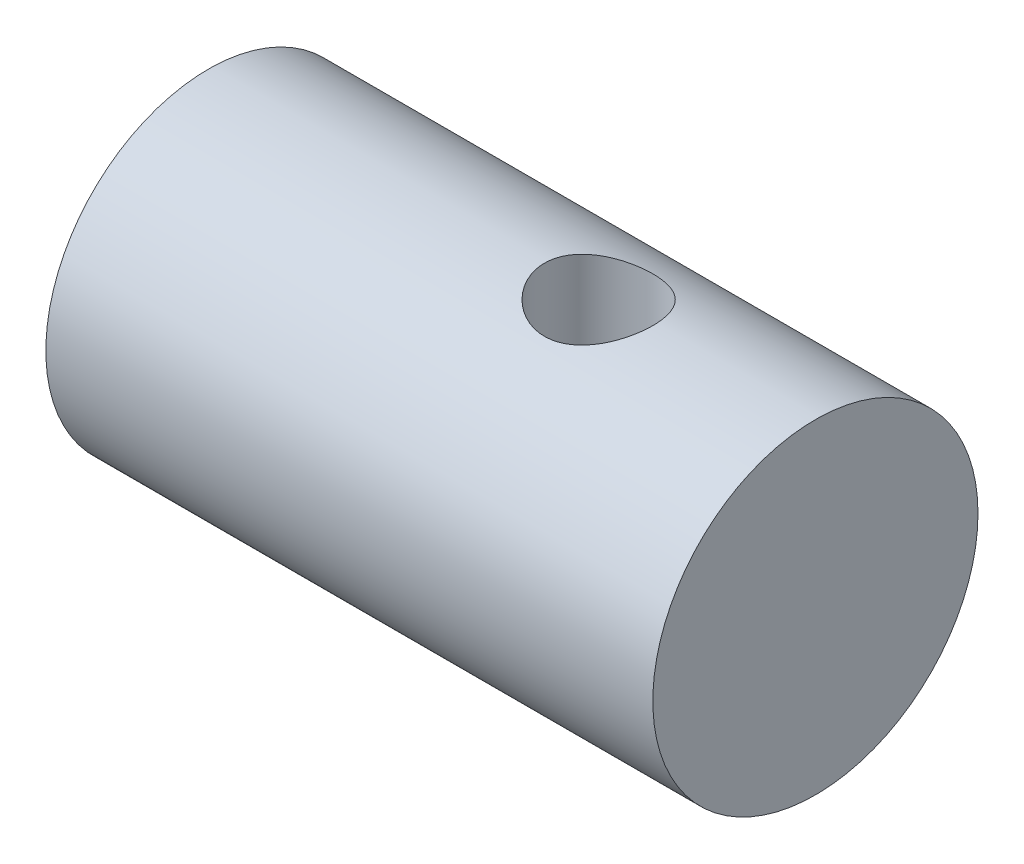
ISO-10303-21;
HEADER;
FILE_DESCRIPTION(('STEP AP214'),'2;1');
FILE_NAME('part.step','',(''),(''),'','','');
FILE_SCHEMA(('AUTOMOTIVE_DESIGN { 1 0 10303 214 1 1 1 1 }'));
ENDSEC;
DATA;
#1=APPLICATION_CONTEXT('core data for automotive mechanical design processes');
#2=APPLICATION_PROTOCOL_DEFINITION('international standard','automotive_design',2000,#1);
#3=PRODUCT_CONTEXT('',#1,'mechanical');
#4=PRODUCT('Part','Part','',(#3));
#5=PRODUCT_RELATED_PRODUCT_CATEGORY('part','',(#4));
#6=PRODUCT_DEFINITION_FORMATION('','',#4);
#7=PRODUCT_DEFINITION_CONTEXT('part definition',#1,'design');
#8=PRODUCT_DEFINITION('design','',#6,#7);
#9=PRODUCT_DEFINITION_SHAPE('','',#8);
#10=(LENGTH_UNIT() NAMED_UNIT(*) SI_UNIT(.MILLI.,.METRE.));
#11=(NAMED_UNIT(*) PLANE_ANGLE_UNIT() SI_UNIT($,.RADIAN.));
#12=(NAMED_UNIT(*) SI_UNIT($,.STERADIAN.) SOLID_ANGLE_UNIT());
#13=UNCERTAINTY_MEASURE_WITH_UNIT(LENGTH_MEASURE(1.E-05),#10,'distance_accuracy_value','');
#14=(GEOMETRIC_REPRESENTATION_CONTEXT(3) GLOBAL_UNCERTAINTY_ASSIGNED_CONTEXT((#13)) GLOBAL_UNIT_ASSIGNED_CONTEXT((#10,
#11,#12)) REPRESENTATION_CONTEXT('',''));
#15=CARTESIAN_POINT('',(0.,0.,0.));
#16=DIRECTION('',(0.,0.,1.));
#17=DIRECTION('',(1.,0.,0.));
#18=AXIS2_PLACEMENT_3D('',#15,#16,#17);
#19=CARTESIAN_POINT('',(2.,-29.,-19.5));
#20=DIRECTION('',(-1.,0.,0.));
#21=DIRECTION('',(0.,0.,1.));
#22=AXIS2_PLACEMENT_3D('',#19,#20,#21);
#23=CYLINDRICAL_SURFACE('',#22,3.);
#24=CARTESIAN_POINT('',(2.,-29.,-19.5));
#25=DIRECTION('',(1.,0.,0.));
#26=DIRECTION('',(0.,0.,-1.));
#27=AXIS2_PLACEMENT_3D('',#24,#25,#26);
#28=CIRCLE('',#27,3.);
#29=CARTESIAN_POINT('',(2.,-29.,-22.5));
#30=VERTEX_POINT('',#29);
#31=EDGE_CURVE('E10',#30,#30,#28,.T.);
#32=ORIENTED_EDGE('',*,*,#31,.F.);
#33=EDGE_LOOP('',(#32));
#34=FACE_BOUND('',#33,.T.);
#35=CARTESIAN_POINT('',(-9.2,-29.,-19.5));
#36=DIRECTION('',(1.,0.,0.));
#37=DIRECTION('',(0.,0.,-1.));
#38=AXIS2_PLACEMENT_3D('',#35,#36,#37);
#39=CIRCLE('',#38,3.);
#40=CARTESIAN_POINT('',(-9.2,-29.,-22.5));
#41=VERTEX_POINT('',#40);
#42=EDGE_CURVE('E51',#41,#41,#39,.T.);
#43=ORIENTED_EDGE('',*,*,#42,.T.);
#44=EDGE_LOOP('',(#43));
#45=FACE_BOUND('',#44,.T.);
#46=CARTESIAN_POINT('',(-2.,-31.8284271247462,-20.5));
#47=CARTESIAN_POINT('',(-1.94553182518932,-31.8284269453273,-20.5000002579478));
#48=CARTESIAN_POINT('',(-1.89106520022847,-31.8300176937281,-20.4955347836981));
#49=CARTESIAN_POINT('',(-1.78374557904938,-31.8361757417458,-20.4778511317026));
#50=CARTESIAN_POINT('',(-1.73089285013606,-31.8407435316722,-20.4646315121707));
#51=CARTESIAN_POINT('',(-1.62837310698719,-31.8522820366389,-20.4299554856803));
#52=CARTESIAN_POINT('',(-1.57870007055312,-31.8592480396464,-20.408515221402));
#53=CARTESIAN_POINT('',(-1.48363995145621,-31.8747912201701,-20.3580616284426));
#54=CARTESIAN_POINT('',(-1.4382538174475,-31.8833687530543,-20.3290466288605));
#55=CARTESIAN_POINT('',(-1.35128003766051,-31.9015448940559,-20.2630511464425));
#56=CARTESIAN_POINT('',(-1.30988457132796,-31.9111689484414,-20.2258243413778));
#57=CARTESIAN_POINT('',(-1.23379319877568,-31.9301386480151,-20.1449876672145));
#58=CARTESIAN_POINT('',(-1.19909836841772,-31.939484248291,-20.1013767750524));
#59=CARTESIAN_POINT('',(-1.13652110267032,-31.9571386692166,-20.007604507965));
#60=CARTESIAN_POINT('',(-1.10884002938202,-31.9654140770157,-19.9573019112245));
#61=CARTESIAN_POINT('',(-1.06240841487251,-31.9796958677102,-19.8524312229875));
#62=CARTESIAN_POINT('',(-1.0436554668231,-31.9857028620301,-19.7978642856872));
#63=CARTESIAN_POINT('',(-1.0162641453676,-31.994590754319,-19.6880288174335));
#64=CARTESIAN_POINT('',(-1.00729655374299,-31.9975731477756,-19.632850754853));
#65=CARTESIAN_POINT('',(-0.998683706639341,-32.0004360821825,-19.5216978748241));
#66=CARTESIAN_POINT('',(-0.999036048347583,-32.0003174226289,-19.4657232664561));
#67=CARTESIAN_POINT('',(-1.00884425456603,-31.9970603961874,-19.3568964848062));
#68=CARTESIAN_POINT('',(-1.01794252847451,-31.9940406475514,-19.3040079514083));
#69=CARTESIAN_POINT('',(-1.04439298098045,-31.9854696733971,-19.2005565611778));
#70=CARTESIAN_POINT('',(-1.06174571897976,-31.9799182763111,-19.1499938622208));
#71=CARTESIAN_POINT('',(-1.10442131730613,-31.9667567029329,-19.051847525158));
#72=CARTESIAN_POINT('',(-1.12984593854678,-31.9591204252427,-19.004311779031));
#73=CARTESIAN_POINT('',(-1.18785970544839,-31.9425839303867,-18.9140756744728));
#74=CARTESIAN_POINT('',(-1.22045084332664,-31.9336833620052,-18.8713766656152));
#75=CARTESIAN_POINT('',(-1.29367439346074,-31.9150619185089,-18.7898991334481));
#76=CARTESIAN_POINT('',(-1.33461315784544,-31.9053221517267,-18.7513998429324));
#77=CARTESIAN_POINT('',(-1.42244872572266,-31.8864733524511,-18.6817227404041));
#78=CARTESIAN_POINT('',(-1.46934644571324,-31.8773644173145,-18.650546056727));
#79=CARTESIAN_POINT('',(-1.56865362561541,-31.8607052513553,-18.5960125449573));
#80=CARTESIAN_POINT('',(-1.62113213136781,-31.8531790933882,-18.572773536349));
#81=CARTESIAN_POINT('',(-1.72957139426626,-31.840816508783,-18.5355568067005));
#82=CARTESIAN_POINT('',(-1.78553068122182,-31.8359789550122,-18.5215752042445));
#83=CARTESIAN_POINT('',(-1.89663835540062,-31.8297963630207,-18.5038387179095));
#84=CARTESIAN_POINT('',(-1.95170942474572,-31.8283036031514,-18.4996509044943));
#85=CARTESIAN_POINT('',(-2.06177614911704,-31.828566720628,-18.5003945610884));
#86=CARTESIAN_POINT('',(-2.11677181602476,-31.8303220079277,-18.5053243747727));
#87=CARTESIAN_POINT('',(-2.22315696571116,-31.8367361808938,-18.5237743484482));
#88=CARTESIAN_POINT('',(-2.27460543015064,-31.8412932544059,-18.5369936060194));
#89=CARTESIAN_POINT('',(-2.37454360623938,-31.8526855367127,-18.5712861374394));
#90=CARTESIAN_POINT('',(-2.42303279159083,-31.8595211493491,-18.5923608036365));
#91=CARTESIAN_POINT('',(-2.51738042084694,-31.8749687759572,-18.6425256592611));
#92=CARTESIAN_POINT('',(-2.56310664264179,-31.8836302566561,-18.6718488816415));
#93=CARTESIAN_POINT('',(-2.64914605238373,-31.9016576873098,-18.7374143694424));
#94=CARTESIAN_POINT('',(-2.68945763866122,-31.911023844438,-18.7736586745012));
#95=CARTESIAN_POINT('',(-2.76552798409063,-31.9299503863784,-18.8541082940997));
#96=CARTESIAN_POINT('',(-2.80097439001885,-31.939498435779,-18.8986127294533));
#97=CARTESIAN_POINT('',(-2.86391614234804,-31.9572685161311,-18.9931727085997));
#98=CARTESIAN_POINT('',(-2.89141177116243,-31.9654905941769,-19.0432280551354));
#99=CARTESIAN_POINT('',(-2.93742010486171,-31.979644058106,-19.1472201375677));
#100=CARTESIAN_POINT('',(-2.95599127714806,-31.9855903000453,-19.2011288766788));
#101=CARTESIAN_POINT('',(-2.9837277420601,-31.9945861083777,-19.311541534154));
#102=CARTESIAN_POINT('',(-2.9928964298805,-31.9976367203402,-19.3680445080461));
#103=CARTESIAN_POINT('',(-3.00126207760564,-32.0004186323626,-19.47918466414));
#104=CARTESIAN_POINT('',(-3.00090745393238,-32.0002992008944,-19.53378472392));
#105=CARTESIAN_POINT('',(-2.99134269185359,-31.997121965194,-19.6421111450002));
#106=CARTESIAN_POINT('',(-2.98213327184724,-31.9940643993357,-19.6958375768191));
#107=CARTESIAN_POINT('',(-2.95541776542403,-31.9854091495442,-19.8000421194321));
#108=CARTESIAN_POINT('',(-2.93804578464705,-31.9798525836118,-19.8505582709128));
#109=CARTESIAN_POINT('',(-2.89562246890286,-31.9667716070446,-19.9479783509398));
#110=CARTESIAN_POINT('',(-2.87056974480306,-31.959246840479,-19.9948816241424));
#111=CARTESIAN_POINT('',(-2.81243048789792,-31.94265868828,-20.0856340163088));
#112=CARTESIAN_POINT('',(-2.77908131461808,-31.9335487249238,-20.1293062515577));
#113=CARTESIAN_POINT('',(-2.70574260884408,-31.9149298879142,-20.2105810262723));
#114=CARTESIAN_POINT('',(-2.66575095773832,-31.905420887714,-20.2481816216243));
#115=CARTESIAN_POINT('',(-2.57839064441196,-31.8866327982737,-20.3177418088335));
#116=CARTESIAN_POINT('',(-2.53079448901923,-31.8773772799534,-20.3494229659992));
#117=CARTESIAN_POINT('',(-2.43066557310135,-31.860601933163,-20.4043143432998));
#118=CARTESIAN_POINT('',(-2.37813410698576,-31.8530816513617,-20.4275267768146));
#119=CARTESIAN_POINT('',(-2.27203817597617,-31.8410133423053,-20.4638438282066));
#120=CARTESIAN_POINT('',(-2.21862773643428,-31.836346329448,-20.4773579091633));
#121=CARTESIAN_POINT('',(-2.11014394948453,-31.8300538361394,-20.4954343201617));
#122=CARTESIAN_POINT('',(-2.05507118256425,-31.8284273061514,-20.4999997391965));
#123=CARTESIAN_POINT('',(-2.,-31.8284271247462,-20.5));
#124=B_SPLINE_CURVE_WITH_KNOTS('',3,(#46,#47,#48,#49,#50,#51,#52,#53,#54,#55,#56,#57,#58,#59,
#60,#61,#62,#63,#64,#65,#66,#67,#68,#69,#70,#71,#72,#73,#74,#75,#76,#77,#78,#79,#80,#81,#82,#83,
#84,#85,#86,#87,#88,#89,#90,#91,#92,#93,#94,#95,#96,#97,#98,#99,#100,#101,#102,#103,#104,#105,
#106,#107,#108,#109,#110,#111,#112,#113,#114,#115,#116,#117,#118,#119,#120,#121,#122,#123),
.UNSPECIFIED.,.T.,.F.,(4,2,2,2,2,2,2,2,2,2,2,2,2,2,2,2,2,2,2,2,2,2,2,2,2,2,2,2,2,2,2,2,2,2,2,2,
2,2,4),(0.,0.163200584775417,0.32642805496888,0.489336627454543,0.652281166139157,
0.821013374229397,0.989772651673595,1.16293506139029,1.33605076382161,1.50314318760306,
1.67019253297699,1.83069004820941,1.99119844184608,2.15381654855707,2.31647991869394,
2.48680174359289,2.65714979607478,2.82992639837376,3.00263051349689,3.16754291357512,
3.33242535830307,3.49164395761849,3.65089079140019,3.81518857728788,3.979534856552,
4.15178808164165,4.32403518750605,4.49513791183924,4.66617882997229,4.82918084670708,
4.99216964002854,5.15256956033503,5.31299850756316,5.47935519513707,5.64576504425705,
5.81868902729218,5.9915677825994,6.15663212153686,6.32163947179229),.UNSPECIFIED.);
#125=CARTESIAN_POINT('',(-2.,-31.8284271247462,-20.5));
#126=VERTEX_POINT('',#125);
#127=EDGE_CURVE('E60',#126,#126,#124,.T.);
#128=ORIENTED_EDGE('',*,*,#127,.F.);
#129=EDGE_LOOP('',(#128));
#130=FACE_BOUND('',#129,.T.);
#131=CARTESIAN_POINT('',(-2.,-26.1715728752538,-20.5));
#132=CARTESIAN_POINT('',(-2.05446817481068,-26.1715730546727,-20.5000002579478));
#133=CARTESIAN_POINT('',(-2.10893479977152,-26.1699823062719,-20.4955347836981));
#134=CARTESIAN_POINT('',(-2.21625442095062,-26.1638242582542,-20.4778511317026));
#135=CARTESIAN_POINT('',(-2.26910714986394,-26.1592564683278,-20.4646315121707));
#136=CARTESIAN_POINT('',(-2.37162689301281,-26.1477179633611,-20.4299554856803));
#137=CARTESIAN_POINT('',(-2.42129992944688,-26.1407519603536,-20.408515221402));
#138=CARTESIAN_POINT('',(-2.51636004854379,-26.1252087798299,-20.3580616284426));
#139=CARTESIAN_POINT('',(-2.5617461825525,-26.1166312469457,-20.3290466288605));
#140=CARTESIAN_POINT('',(-2.64871996233949,-26.0984551059441,-20.2630511464425));
#141=CARTESIAN_POINT('',(-2.69011542867204,-26.0888310515586,-20.2258243413778));
#142=CARTESIAN_POINT('',(-2.76620680122432,-26.0698613519849,-20.1449876672145));
#143=CARTESIAN_POINT('',(-2.80090163158228,-26.060515751709,-20.1013767750524));
#144=CARTESIAN_POINT('',(-2.86347889732968,-26.0428613307834,-20.007604507965));
#145=CARTESIAN_POINT('',(-2.89115997061798,-26.0345859229843,-19.9573019112245));
#146=CARTESIAN_POINT('',(-2.93759158512749,-26.0203041322898,-19.8524312229875));
#147=CARTESIAN_POINT('',(-2.9563445331769,-26.0142971379699,-19.7978642856872));
#148=CARTESIAN_POINT('',(-2.9837358546324,-26.005409245681,-19.6880288174335));
#149=CARTESIAN_POINT('',(-2.99270344625701,-26.0024268522244,-19.632850754853));
#150=CARTESIAN_POINT('',(-3.00131629336066,-25.9995639178175,-19.5216978748241));
#151=CARTESIAN_POINT('',(-3.00096395165242,-25.9996825773711,-19.4657232664561));
#152=CARTESIAN_POINT('',(-2.99115574543397,-26.0029396038126,-19.3568964848062));
#153=CARTESIAN_POINT('',(-2.98205747152549,-26.0059593524486,-19.3040079514083));
#154=CARTESIAN_POINT('',(-2.95560701901955,-26.0145303266029,-19.2005565611778));
#155=CARTESIAN_POINT('',(-2.93825428102025,-26.0200817236889,-19.1499938622208));
#156=CARTESIAN_POINT('',(-2.89557868269387,-26.0332432970671,-19.051847525158));
#157=CARTESIAN_POINT('',(-2.87015406145322,-26.0408795747573,-19.004311779031));
#158=CARTESIAN_POINT('',(-2.81214029455161,-26.0574160696133,-18.9140756744728));
#159=CARTESIAN_POINT('',(-2.77954915667336,-26.0663166379948,-18.8713766656152));
#160=CARTESIAN_POINT('',(-2.70632560653926,-26.0849380814911,-18.7898991334481));
#161=CARTESIAN_POINT('',(-2.66538684215456,-26.0946778482733,-18.7513998429324));
#162=CARTESIAN_POINT('',(-2.57755127427734,-26.1135266475489,-18.6817227404041));
#163=CARTESIAN_POINT('',(-2.53065355428676,-26.1226355826855,-18.650546056727));
#164=CARTESIAN_POINT('',(-2.43134637438459,-26.1392947486447,-18.5960125449573));
#165=CARTESIAN_POINT('',(-2.37886786863219,-26.1468209066118,-18.572773536349));
#166=CARTESIAN_POINT('',(-2.27042860573374,-26.159183491217,-18.5355568067005));
#167=CARTESIAN_POINT('',(-2.21446931877818,-26.1640210449878,-18.5215752042445));
#168=CARTESIAN_POINT('',(-2.10336164459938,-26.1702036369793,-18.5038387179095));
#169=CARTESIAN_POINT('',(-2.04829057525428,-26.1716963968486,-18.4996509044943));
#170=CARTESIAN_POINT('',(-1.93822385088296,-26.171433279372,-18.5003945610884));
#171=CARTESIAN_POINT('',(-1.88322818397524,-26.1696779920723,-18.5053243747727));
#172=CARTESIAN_POINT('',(-1.77684303428884,-26.1632638191062,-18.5237743484482));
#173=CARTESIAN_POINT('',(-1.72539456984936,-26.1587067455941,-18.5369936060194));
#174=CARTESIAN_POINT('',(-1.62545639376062,-26.1473144632873,-18.5712861374394));
#175=CARTESIAN_POINT('',(-1.57696720840917,-26.1404788506509,-18.5923608036365));
#176=CARTESIAN_POINT('',(-1.48261957915306,-26.1250312240428,-18.6425256592611));
#177=CARTESIAN_POINT('',(-1.43689335735821,-26.1163697433439,-18.6718488816415));
#178=CARTESIAN_POINT('',(-1.35085394761627,-26.0983423126902,-18.7374143694424));
#179=CARTESIAN_POINT('',(-1.31054236133878,-26.088976155562,-18.7736586745012));
#180=CARTESIAN_POINT('',(-1.23447201590937,-26.0700496136216,-18.8541082940997));
#181=CARTESIAN_POINT('',(-1.19902560998115,-26.0605015642211,-18.8986127294533));
#182=CARTESIAN_POINT('',(-1.13608385765196,-26.0427314838689,-18.9931727085997));
#183=CARTESIAN_POINT('',(-1.10858822883758,-26.034509405823,-19.0432280551354));
#184=CARTESIAN_POINT('',(-1.06257989513828,-26.020355941894,-19.1472201375677));
#185=CARTESIAN_POINT('',(-1.04400872285193,-26.0144096999547,-19.2011288766788));
#186=CARTESIAN_POINT('',(-1.01627225793989,-26.0054138916223,-19.311541534154));
#187=CARTESIAN_POINT('',(-1.0071035701195,-26.0023632796598,-19.3680445080461));
#188=CARTESIAN_POINT('',(-0.998737922394358,-25.9995813676374,-19.47918466414));
#189=CARTESIAN_POINT('',(-0.999092546067624,-25.9997007991056,-19.53378472392));
#190=CARTESIAN_POINT('',(-1.00865730814641,-26.002878034806,-19.6421111450002));
#191=CARTESIAN_POINT('',(-1.01786672815276,-26.0059356006643,-19.6958375768191));
#192=CARTESIAN_POINT('',(-1.04458223457597,-26.0145908504558,-19.8000421194321));
#193=CARTESIAN_POINT('',(-1.06195421535295,-26.0201474163882,-19.8505582709128));
#194=CARTESIAN_POINT('',(-1.10437753109714,-26.0332283929554,-19.9479783509398));
#195=CARTESIAN_POINT('',(-1.12943025519694,-26.040753159521,-19.9948816241424));
#196=CARTESIAN_POINT('',(-1.18756951210208,-26.05734131172,-20.0856340163088));
#197=CARTESIAN_POINT('',(-1.22091868538192,-26.0664512750762,-20.1293062515577));
#198=CARTESIAN_POINT('',(-1.29425739115592,-26.0850701120858,-20.2105810262723));
#199=CARTESIAN_POINT('',(-1.33424904226168,-26.094579112286,-20.2481816216243));
#200=CARTESIAN_POINT('',(-1.42160935558804,-26.1133672017264,-20.3177418088335));
#201=CARTESIAN_POINT('',(-1.46920551098077,-26.1226227200466,-20.3494229659992));
#202=CARTESIAN_POINT('',(-1.56933442689865,-26.139398066837,-20.4043143432998));
#203=CARTESIAN_POINT('',(-1.62186589301424,-26.1469183486383,-20.4275267768146));
#204=CARTESIAN_POINT('',(-1.72796182402383,-26.1589866576947,-20.4638438282066));
#205=CARTESIAN_POINT('',(-1.78137226356572,-26.163653670552,-20.4773579091633));
#206=CARTESIAN_POINT('',(-1.88985605051548,-26.1699461638606,-20.4954343201617));
#207=CARTESIAN_POINT('',(-1.94492881743575,-26.1715726938486,-20.4999997391965));
#208=CARTESIAN_POINT('',(-2.,-26.1715728752538,-20.5));
#209=B_SPLINE_CURVE_WITH_KNOTS('',3,(#131,#132,#133,#134,#135,#136,#137,#138,#139,#140,#141,
#142,#143,#144,#145,#146,#147,#148,#149,#150,#151,#152,#153,#154,#155,#156,#157,#158,#159,#160,
#161,#162,#163,#164,#165,#166,#167,#168,#169,#170,#171,#172,#173,#174,#175,#176,#177,#178,#179,
#180,#181,#182,#183,#184,#185,#186,#187,#188,#189,#190,#191,#192,#193,#194,#195,#196,#197,#198,
#199,#200,#201,#202,#203,#204,#205,#206,#207,#208),.UNSPECIFIED.,.T.,.F.,(4,2,2,2,2,2,2,2,2,2,2,
2,2,2,2,2,2,2,2,2,2,2,2,2,2,2,2,2,2,2,2,2,2,2,2,2,2,2,4),(0.,0.163200584775417,0.32642805496888,
0.489336627454543,0.652281166139157,0.821013374229396,0.989772651673595,1.16293506139028,
1.33605076382161,1.50314318760306,1.67019253297699,1.8306900482094,1.99119844184608,
2.15381654855706,2.31647991869394,2.48680174359289,2.65714979607478,2.82992639837376,
3.00263051349689,3.16754291357513,3.33242535830307,3.49164395761849,3.65089079140019,
3.81518857728788,3.979534856552,4.15178808164165,4.32403518750605,4.49513791183925,
4.6661788299723,4.82918084670709,4.99216964002854,5.15256956033503,5.31299850756316,
5.47935519513707,5.64576504425704,5.81868902729218,5.9915677825994,6.15663212153686,
6.32163947179229),.UNSPECIFIED.);
#210=CARTESIAN_POINT('',(-2.,-26.1715728752538,-20.5));
#211=VERTEX_POINT('',#210);
#212=EDGE_CURVE('E43',#211,#211,#209,.T.);
#213=ORIENTED_EDGE('',*,*,#212,.F.);
#214=EDGE_LOOP('',(#213));
#215=FACE_BOUND('',#214,.T.);
#216=ADVANCED_FACE('F39',(#34,#45,#130,#215),#23,.T.);
#217=CARTESIAN_POINT('',(2.,-29.,-19.5));
#218=DIRECTION('',(1.,0.,0.));
#219=DIRECTION('',(0.,0.,-1.));
#220=AXIS2_PLACEMENT_3D('',#217,#218,#219);
#221=PLANE('',#220);
#222=ORIENTED_EDGE('',*,*,#31,.T.);
#223=EDGE_LOOP('',(#222));
#224=FACE_BOUND('',#223,.T.);
#225=ADVANCED_FACE('F67',(#224),#221,.T.);
#226=CARTESIAN_POINT('',(-9.2,-29.,-19.5));
#227=DIRECTION('',(1.,0.,0.));
#228=DIRECTION('',(0.,0.,-1.));
#229=AXIS2_PLACEMENT_3D('',#226,#227,#228);
#230=PLANE('',#229);
#231=ORIENTED_EDGE('',*,*,#42,.F.);
#232=EDGE_LOOP('',(#231));
#233=FACE_BOUND('',#232,.T.);
#234=ADVANCED_FACE('F66',(#233),#230,.F.);
#235=CARTESIAN_POINT('',(-2.,-25.,-19.5));
#236=DIRECTION('',(0.,-1.,0.));
#237=DIRECTION('',(0.,0.,-1.));
#238=AXIS2_PLACEMENT_3D('',#235,#236,#237);
#239=CYLINDRICAL_SURFACE('',#238,1.);
#240=ORIENTED_EDGE('',*,*,#127,.T.);
#241=EDGE_LOOP('',(#240));
#242=FACE_BOUND('',#241,.T.);
#243=ORIENTED_EDGE('',*,*,#212,.T.);
#244=EDGE_LOOP('',(#243));
#245=FACE_BOUND('',#244,.T.);
#246=ADVANCED_FACE('F62',(#242,#245),#239,.F.);
#247=CLOSED_SHELL('',(#216,#225,#234,#246));
#248=MANIFOLD_SOLID_BREP('B2',#247);
#249=ADVANCED_BREP_SHAPE_REPRESENTATION('',(#18,#248),#14);
#250=SHAPE_DEFINITION_REPRESENTATION(#9,#249);
ENDSEC;
END-ISO-10303-21;
